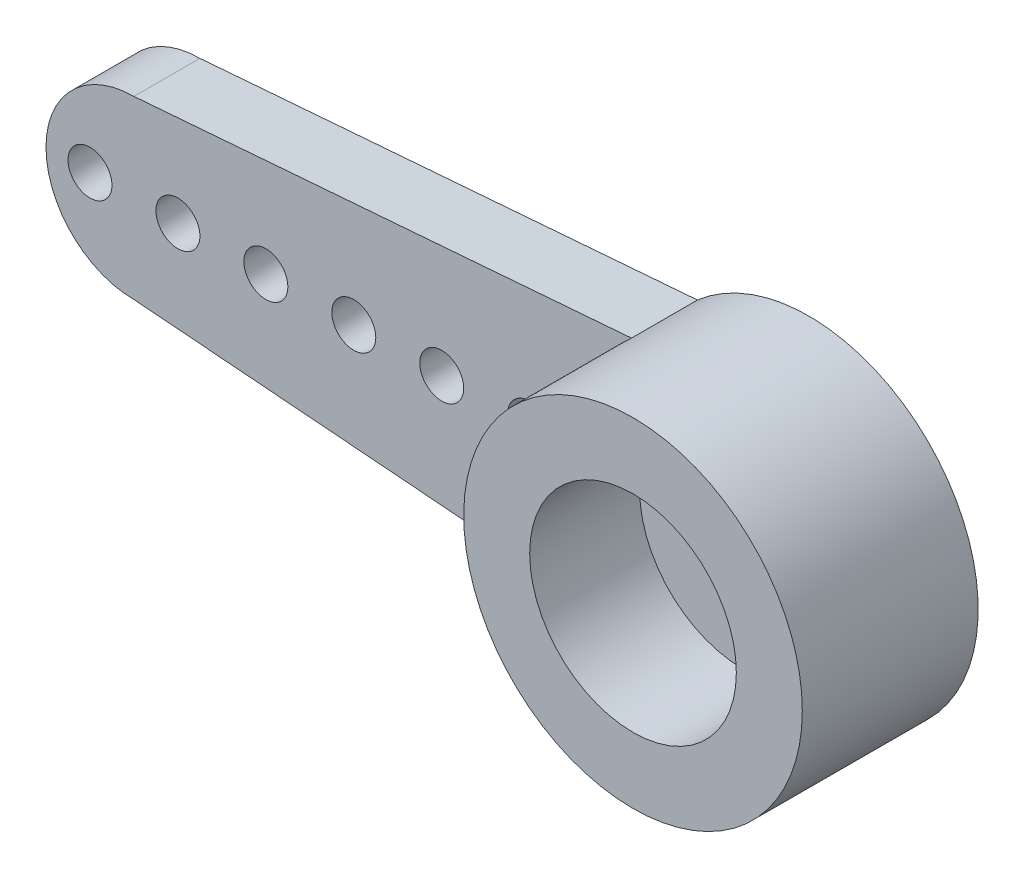
ISO-10303-21;
HEADER;
FILE_DESCRIPTION(('STEP AP214'),'2;1');
FILE_NAME('part.step','',(''),(''),'','','');
FILE_SCHEMA(('AUTOMOTIVE_DESIGN { 1 0 10303 214 1 1 1 1 }'));
ENDSEC;
DATA;
#1=APPLICATION_CONTEXT('core data for automotive mechanical design processes');
#2=APPLICATION_PROTOCOL_DEFINITION('international standard','automotive_design',2000,#1);
#3=PRODUCT_CONTEXT('',#1,'mechanical');
#4=PRODUCT('Part','Part','',(#3));
#5=PRODUCT_RELATED_PRODUCT_CATEGORY('part','',(#4));
#6=PRODUCT_DEFINITION_FORMATION('','',#4);
#7=PRODUCT_DEFINITION_CONTEXT('part definition',#1,'design');
#8=PRODUCT_DEFINITION('design','',#6,#7);
#9=PRODUCT_DEFINITION_SHAPE('','',#8);
#10=(LENGTH_UNIT() NAMED_UNIT(*) SI_UNIT(.MILLI.,.METRE.));
#11=(NAMED_UNIT(*) PLANE_ANGLE_UNIT() SI_UNIT($,.RADIAN.));
#12=(NAMED_UNIT(*) SI_UNIT($,.STERADIAN.) SOLID_ANGLE_UNIT());
#13=UNCERTAINTY_MEASURE_WITH_UNIT(LENGTH_MEASURE(1.E-05),#10,'distance_accuracy_value','');
#14=(GEOMETRIC_REPRESENTATION_CONTEXT(3) GLOBAL_UNCERTAINTY_ASSIGNED_CONTEXT((#13)) GLOBAL_UNIT_ASSIGNED_CONTEXT((#10,
#11,#12)) REPRESENTATION_CONTEXT('',''));
#15=CARTESIAN_POINT('',(0.,0.,0.));
#16=DIRECTION('',(0.,0.,1.));
#17=DIRECTION('',(1.,0.,0.));
#18=AXIS2_PLACEMENT_3D('',#15,#16,#17);
#19=CARTESIAN_POINT('',(0.,0.,4.));
#20=DIRECTION('',(0.,0.,-1.));
#21=DIRECTION('',(-1.,0.,0.));
#22=AXIS2_PLACEMENT_3D('',#19,#20,#21);
#23=CYLINDRICAL_SURFACE('',#22,2.35);
#24=CARTESIAN_POINT('',(0.,0.,4.));
#25=DIRECTION('',(0.,0.,1.));
#26=DIRECTION('',(1.,0.,0.));
#27=AXIS2_PLACEMENT_3D('',#24,#25,#26);
#28=CIRCLE('',#27,2.35);
#29=CARTESIAN_POINT('',(2.35,0.,4.));
#30=VERTEX_POINT('',#29);
#31=EDGE_CURVE('E110',#30,#30,#28,.T.);
#32=ORIENTED_EDGE('',*,*,#31,.T.);
#33=EDGE_LOOP('',(#32));
#34=FACE_BOUND('',#33,.T.);
#35=CARTESIAN_POINT('',(0.,0.,1.5));
#36=DIRECTION('',(0.,0.,-1.));
#37=DIRECTION('',(-1.,0.,0.));
#38=AXIS2_PLACEMENT_3D('',#35,#36,#37);
#39=CIRCLE('',#38,2.35);
#40=CARTESIAN_POINT('',(-2.35,0.,1.5));
#41=VERTEX_POINT('',#40);
#42=EDGE_CURVE('E107',#41,#41,#39,.T.);
#43=ORIENTED_EDGE('',*,*,#42,.T.);
#44=EDGE_LOOP('',(#43));
#45=FACE_BOUND('',#44,.T.);
#46=ADVANCED_FACE('F37',(#34,#45),#23,.F.);
#47=CARTESIAN_POINT('',(0.,0.,4.));
#48=DIRECTION('',(0.,0.,1.));
#49=DIRECTION('',(1.,0.,0.));
#50=AXIS2_PLACEMENT_3D('',#47,#48,#49);
#51=PLANE('',#50);
#52=CARTESIAN_POINT('',(0.,0.,4.));
#53=DIRECTION('',(0.,0.,1.));
#54=DIRECTION('',(1.,0.,0.));
#55=AXIS2_PLACEMENT_3D('',#52,#53,#54);
#56=CIRCLE('',#55,3.85);
#57=CARTESIAN_POINT('',(3.85,0.,4.));
#58=VERTEX_POINT('',#57);
#59=EDGE_CURVE('E114',#58,#58,#56,.T.);
#60=ORIENTED_EDGE('',*,*,#59,.T.);
#61=EDGE_LOOP('',(#60));
#62=FACE_BOUND('',#61,.T.);
#63=ORIENTED_EDGE('',*,*,#31,.F.);
#64=EDGE_LOOP('',(#63));
#65=FACE_BOUND('',#64,.T.);
#66=ADVANCED_FACE('F137',(#62,#65),#51,.T.);
#67=CARTESIAN_POINT('',(0.,0.,0.));
#68=DIRECTION('',(0.,0.,1.));
#69=DIRECTION('',(1.,0.,0.));
#70=AXIS2_PLACEMENT_3D('',#67,#68,#69);
#71=PLANE('',#70);
#72=CARTESIAN_POINT('',(-14.85,0.,0.));
#73=DIRECTION('',(0.,0.,1.));
#74=DIRECTION('',(1.,0.,0.));
#75=AXIS2_PLACEMENT_3D('',#72,#73,#74);
#76=CIRCLE('',#75,0.499999999999999);
#77=CARTESIAN_POINT('',(-14.35,0.,0.));
#78=VERTEX_POINT('',#77);
#79=EDGE_CURVE('E154',#78,#78,#76,.F.);
#80=ORIENTED_EDGE('',*,*,#79,.F.);
#81=EDGE_LOOP('',(#80));
#82=FACE_BOUND('',#81,.T.);
#83=CARTESIAN_POINT('',(-12.85,0.,0.));
#84=DIRECTION('',(0.,0.,1.));
#85=DIRECTION('',(1.,0.,0.));
#86=AXIS2_PLACEMENT_3D('',#83,#84,#85);
#87=CIRCLE('',#86,0.499999999999999);
#88=CARTESIAN_POINT('',(-12.35,0.,0.));
#89=VERTEX_POINT('',#88);
#90=EDGE_CURVE('E158',#89,#89,#87,.F.);
#91=ORIENTED_EDGE('',*,*,#90,.F.);
#92=EDGE_LOOP('',(#91));
#93=FACE_BOUND('',#92,.T.);
#94=CARTESIAN_POINT('',(-10.85,0.,0.));
#95=DIRECTION('',(0.,0.,1.));
#96=DIRECTION('',(1.,0.,0.));
#97=AXIS2_PLACEMENT_3D('',#94,#95,#96);
#98=CIRCLE('',#97,0.499999999999999);
#99=CARTESIAN_POINT('',(-10.35,0.,0.));
#100=VERTEX_POINT('',#99);
#101=EDGE_CURVE('E162',#100,#100,#98,.F.);
#102=ORIENTED_EDGE('',*,*,#101,.F.);
#103=EDGE_LOOP('',(#102));
#104=FACE_BOUND('',#103,.T.);
#105=CARTESIAN_POINT('',(-8.85,0.,0.));
#106=DIRECTION('',(0.,0.,1.));
#107=DIRECTION('',(1.,0.,0.));
#108=AXIS2_PLACEMENT_3D('',#105,#106,#107);
#109=CIRCLE('',#108,0.499999999999999);
#110=CARTESIAN_POINT('',(-8.35,0.,0.));
#111=VERTEX_POINT('',#110);
#112=EDGE_CURVE('E166',#111,#111,#109,.F.);
#113=ORIENTED_EDGE('',*,*,#112,.F.);
#114=EDGE_LOOP('',(#113));
#115=FACE_BOUND('',#114,.T.);
#116=CARTESIAN_POINT('',(-6.85,0.,0.));
#117=DIRECTION('',(0.,0.,1.));
#118=DIRECTION('',(1.,0.,0.));
#119=AXIS2_PLACEMENT_3D('',#116,#117,#118);
#120=CIRCLE('',#119,0.499999999999999);
#121=CARTESIAN_POINT('',(-6.35,0.,0.));
#122=VERTEX_POINT('',#121);
#123=EDGE_CURVE('E170',#122,#122,#120,.F.);
#124=ORIENTED_EDGE('',*,*,#123,.F.);
#125=EDGE_LOOP('',(#124));
#126=FACE_BOUND('',#125,.T.);
#127=CARTESIAN_POINT('',(-4.85,0.,0.));
#128=DIRECTION('',(0.,0.,1.));
#129=DIRECTION('',(1.,0.,0.));
#130=AXIS2_PLACEMENT_3D('',#127,#128,#129);
#131=CIRCLE('',#130,0.499999999999999);
#132=CARTESIAN_POINT('',(-4.35,0.,0.));
#133=VERTEX_POINT('',#132);
#134=EDGE_CURVE('E103',#133,#133,#131,.F.);
#135=ORIENTED_EDGE('',*,*,#134,.F.);
#136=EDGE_LOOP('',(#135));
#137=FACE_BOUND('',#136,.T.);
#138=DIRECTION('',(0.996860885732547,0.079173066736881,0.));
#139=VECTOR('',#138,1.);
#140=CARTESIAN_POINT('',(0.,3.1,0.));
#141=LINE('',#140,#139);
#142=CARTESIAN_POINT('',(-13.85,2.,0.));
#143=VERTEX_POINT('',#142);
#144=CARTESIAN_POINT('',(-2.53370243949322,2.89876731527491,0.));
#145=VERTEX_POINT('',#144);
#146=EDGE_CURVE('E84',#143,#145,#141,.T.);
#147=ORIENTED_EDGE('',*,*,#146,.T.);
#148=CARTESIAN_POINT('',(0.,0.,0.));
#149=DIRECTION('',(0.,0.,1.));
#150=DIRECTION('',(1.,0.,0.));
#151=AXIS2_PLACEMENT_3D('',#148,#149,#150);
#152=CIRCLE('',#151,3.85);
#153=CARTESIAN_POINT('',(-2.53370243949322,-2.89876731527491,0.));
#154=VERTEX_POINT('',#153);
#155=EDGE_CURVE('E113',#154,#145,#152,.T.);
#156=ORIENTED_EDGE('',*,*,#155,.F.);
#157=DIRECTION('',(-0.996860885732547,0.079173066736881,0.));
#158=VECTOR('',#157,1.);
#159=CARTESIAN_POINT('',(0.,-3.1,0.));
#160=LINE('',#159,#158);
#161=CARTESIAN_POINT('',(-13.85,-2.,0.));
#162=VERTEX_POINT('',#161);
#163=EDGE_CURVE('E101',#154,#162,#160,.T.);
#164=ORIENTED_EDGE('',*,*,#163,.T.);
#165=CARTESIAN_POINT('',(-13.85,0.,0.));
#166=DIRECTION('',(0.,0.,-1.));
#167=DIRECTION('',(-1.,0.,0.));
#168=AXIS2_PLACEMENT_3D('',#165,#166,#167);
#169=CIRCLE('',#168,2.);
#170=EDGE_CURVE('E91',#162,#143,#169,.T.);
#171=ORIENTED_EDGE('',*,*,#170,.T.);
#172=EDGE_LOOP('',(#147,#156,#164,#171));
#173=FACE_BOUND('',#172,.T.);
#174=ADVANCED_FACE('F121',(#82,#93,#104,#115,#126,#137,#173),#71,.F.);
#175=CARTESIAN_POINT('',(0.,0.,4.));
#176=DIRECTION('',(0.,0.,-1.));
#177=DIRECTION('',(-1.,0.,0.));
#178=AXIS2_PLACEMENT_3D('',#175,#176,#177);
#179=CYLINDRICAL_SURFACE('',#178,3.85);
#180=ORIENTED_EDGE('',*,*,#155,.T.);
#181=DIRECTION('',(0.,0.,-1.));
#182=VECTOR('',#181,1.);
#183=CARTESIAN_POINT('',(-2.53370243949322,2.89876731527491,4.));
#184=LINE('',#183,#182);
#185=CARTESIAN_POINT('',(-2.53370243949322,2.89876731527491,1.5));
#186=VERTEX_POINT('',#185);
#187=EDGE_CURVE('E11',#145,#186,#184,.F.);
#188=ORIENTED_EDGE('',*,*,#187,.T.);
#189=CARTESIAN_POINT('',(0.,0.,1.5));
#190=DIRECTION('',(0.,0.,-1.));
#191=DIRECTION('',(-1.,0.,0.));
#192=AXIS2_PLACEMENT_3D('',#189,#190,#191);
#193=CIRCLE('',#192,3.85);
#194=CARTESIAN_POINT('',(-2.53370243949322,-2.89876731527491,1.5));
#195=VERTEX_POINT('',#194);
#196=EDGE_CURVE('E54',#195,#186,#193,.T.);
#197=ORIENTED_EDGE('',*,*,#196,.F.);
#198=DIRECTION('',(0.,0.,-1.));
#199=VECTOR('',#198,1.);
#200=CARTESIAN_POINT('',(-2.53370243949322,-2.89876731527491,4.));
#201=LINE('',#200,#199);
#202=EDGE_CURVE('E45',#195,#154,#201,.T.);
#203=ORIENTED_EDGE('',*,*,#202,.T.);
#204=EDGE_LOOP('',(#180,#188,#197,#203));
#205=FACE_BOUND('',#204,.T.);
#206=ORIENTED_EDGE('',*,*,#59,.F.);
#207=EDGE_LOOP('',(#206));
#208=FACE_BOUND('',#207,.T.);
#209=ADVANCED_FACE('F39',(#205,#208),#179,.T.);
#210=CARTESIAN_POINT('',(0.,0.,1.5));
#211=DIRECTION('',(0.,0.,-1.));
#212=DIRECTION('',(-1.,0.,0.));
#213=AXIS2_PLACEMENT_3D('',#210,#211,#212);
#214=PLANE('',#213);
#215=ORIENTED_EDGE('',*,*,#42,.F.);
#216=EDGE_LOOP('',(#215));
#217=FACE_BOUND('',#216,.T.);
#218=ADVANCED_FACE('F126',(#217),#214,.F.);
#219=CARTESIAN_POINT('',(0.,3.1,1.5));
#220=DIRECTION('',(-0.079173066736881,0.996860885732547,0.));
#221=DIRECTION('',(-0.996860885732547,-0.079173066736881,0.));
#222=AXIS2_PLACEMENT_3D('',#219,#220,#221);
#223=PLANE('',#222);
#224=ORIENTED_EDGE('',*,*,#187,.F.);
#225=ORIENTED_EDGE('',*,*,#146,.F.);
#226=DIRECTION('',(0.,0.,-1.));
#227=VECTOR('',#226,1.);
#228=CARTESIAN_POINT('',(-13.85,2.,1.5));
#229=LINE('',#228,#227);
#230=CARTESIAN_POINT('',(-13.85,2.,1.5));
#231=VERTEX_POINT('',#230);
#232=EDGE_CURVE('E92',#231,#143,#229,.T.);
#233=ORIENTED_EDGE('',*,*,#232,.F.);
#234=DIRECTION('',(0.996860885732547,0.079173066736881,0.));
#235=VECTOR('',#234,1.);
#236=CARTESIAN_POINT('',(0.,3.1,1.5));
#237=LINE('',#236,#235);
#238=EDGE_CURVE('E93',#231,#186,#237,.T.);
#239=ORIENTED_EDGE('',*,*,#238,.T.);
#240=EDGE_LOOP('',(#224,#225,#233,#239));
#241=FACE_BOUND('',#240,.T.);
#242=ADVANCED_FACE('F124',(#241),#223,.T.);
#243=CARTESIAN_POINT('',(0.,-3.1,1.5));
#244=DIRECTION('',(-0.079173066736881,-0.996860885732547,0.));
#245=DIRECTION('',(0.996860885732547,-0.079173066736881,0.));
#246=AXIS2_PLACEMENT_3D('',#243,#244,#245);
#247=PLANE('',#246);
#248=ORIENTED_EDGE('',*,*,#202,.F.);
#249=DIRECTION('',(-0.996860885732547,0.079173066736881,0.));
#250=VECTOR('',#249,1.);
#251=CARTESIAN_POINT('',(0.,-3.1,1.5));
#252=LINE('',#251,#250);
#253=CARTESIAN_POINT('',(-13.85,-2.,1.5));
#254=VERTEX_POINT('',#253);
#255=EDGE_CURVE('E75',#195,#254,#252,.T.);
#256=ORIENTED_EDGE('',*,*,#255,.T.);
#257=DIRECTION('',(0.,0.,-1.));
#258=VECTOR('',#257,1.);
#259=CARTESIAN_POINT('',(-13.85,-2.,1.5));
#260=LINE('',#259,#258);
#261=EDGE_CURVE('E79',#254,#162,#260,.T.);
#262=ORIENTED_EDGE('',*,*,#261,.T.);
#263=ORIENTED_EDGE('',*,*,#163,.F.);
#264=EDGE_LOOP('',(#248,#256,#262,#263));
#265=FACE_BOUND('',#264,.T.);
#266=ADVANCED_FACE('F77',(#265),#247,.T.);
#267=CARTESIAN_POINT('',(-13.85,0.,1.5));
#268=DIRECTION('',(0.,0.,-1.));
#269=DIRECTION('',(-1.,0.,0.));
#270=AXIS2_PLACEMENT_3D('',#267,#268,#269);
#271=CYLINDRICAL_SURFACE('',#270,2.);
#272=ORIENTED_EDGE('',*,*,#170,.F.);
#273=ORIENTED_EDGE('',*,*,#261,.F.);
#274=CARTESIAN_POINT('',(-13.85,0.,1.5));
#275=DIRECTION('',(0.,0.,-1.));
#276=DIRECTION('',(-1.,0.,0.));
#277=AXIS2_PLACEMENT_3D('',#274,#275,#276);
#278=CIRCLE('',#277,2.);
#279=EDGE_CURVE('E83',#254,#231,#278,.T.);
#280=ORIENTED_EDGE('',*,*,#279,.T.);
#281=ORIENTED_EDGE('',*,*,#232,.T.);
#282=EDGE_LOOP('',(#272,#273,#280,#281));
#283=FACE_BOUND('',#282,.T.);
#284=ADVANCED_FACE('F88',(#283),#271,.T.);
#285=CARTESIAN_POINT('',(-14.85,0.,1.5));
#286=DIRECTION('',(0.,0.,1.));
#287=DIRECTION('',(1.,0.,0.));
#288=AXIS2_PLACEMENT_3D('',#285,#286,#287);
#289=CIRCLE('',#288,0.499999999999999);
#290=CARTESIAN_POINT('',(-14.35,0.,1.5));
#291=VERTEX_POINT('',#290);
#292=EDGE_CURVE('E195',#291,#291,#289,.T.);
#293=ORIENTED_EDGE('',*,*,#292,.F.);
#294=EDGE_LOOP('',(#293));
#295=FACE_BOUND('',#294,.T.);
#296=CARTESIAN_POINT('',(-12.85,0.,1.5));
#297=DIRECTION('',(0.,0.,1.));
#298=DIRECTION('',(1.,0.,0.));
#299=AXIS2_PLACEMENT_3D('',#296,#297,#298);
#300=CIRCLE('',#299,0.499999999999999);
#301=CARTESIAN_POINT('',(-12.35,0.,1.5));
#302=VERTEX_POINT('',#301);
#303=EDGE_CURVE('E191',#302,#302,#300,.T.);
#304=ORIENTED_EDGE('',*,*,#303,.F.);
#305=EDGE_LOOP('',(#304));
#306=FACE_BOUND('',#305,.T.);
#307=CARTESIAN_POINT('',(-10.85,0.,1.5));
#308=DIRECTION('',(0.,0.,1.));
#309=DIRECTION('',(1.,0.,0.));
#310=AXIS2_PLACEMENT_3D('',#307,#308,#309);
#311=CIRCLE('',#310,0.499999999999999);
#312=CARTESIAN_POINT('',(-10.35,0.,1.5));
#313=VERTEX_POINT('',#312);
#314=EDGE_CURVE('E187',#313,#313,#311,.T.);
#315=ORIENTED_EDGE('',*,*,#314,.F.);
#316=EDGE_LOOP('',(#315));
#317=FACE_BOUND('',#316,.T.);
#318=CARTESIAN_POINT('',(-8.85,0.,1.5));
#319=DIRECTION('',(0.,0.,1.));
#320=DIRECTION('',(1.,0.,0.));
#321=AXIS2_PLACEMENT_3D('',#318,#319,#320);
#322=CIRCLE('',#321,0.499999999999999);
#323=CARTESIAN_POINT('',(-8.35,0.,1.5));
#324=VERTEX_POINT('',#323);
#325=EDGE_CURVE('E183',#324,#324,#322,.T.);
#326=ORIENTED_EDGE('',*,*,#325,.F.);
#327=EDGE_LOOP('',(#326));
#328=FACE_BOUND('',#327,.T.);
#329=CARTESIAN_POINT('',(-6.85,0.,1.5));
#330=DIRECTION('',(0.,0.,1.));
#331=DIRECTION('',(1.,0.,0.));
#332=AXIS2_PLACEMENT_3D('',#329,#330,#331);
#333=CIRCLE('',#332,0.499999999999999);
#334=CARTESIAN_POINT('',(-6.35,0.,1.5));
#335=VERTEX_POINT('',#334);
#336=EDGE_CURVE('E179',#335,#335,#333,.T.);
#337=ORIENTED_EDGE('',*,*,#336,.F.);
#338=EDGE_LOOP('',(#337));
#339=FACE_BOUND('',#338,.T.);
#340=CARTESIAN_POINT('',(-4.85,0.,1.5));
#341=DIRECTION('',(0.,0.,1.));
#342=DIRECTION('',(1.,0.,0.));
#343=AXIS2_PLACEMENT_3D('',#340,#341,#342);
#344=CIRCLE('',#343,0.499999999999999);
#345=CARTESIAN_POINT('',(-4.35,0.,1.5));
#346=VERTEX_POINT('',#345);
#347=EDGE_CURVE('E174',#346,#346,#344,.T.);
#348=ORIENTED_EDGE('',*,*,#347,.F.);
#349=EDGE_LOOP('',(#348));
#350=FACE_BOUND('',#349,.T.);
#351=ORIENTED_EDGE('',*,*,#255,.F.);
#352=ORIENTED_EDGE('',*,*,#196,.T.);
#353=ORIENTED_EDGE('',*,*,#238,.F.);
#354=ORIENTED_EDGE('',*,*,#279,.F.);
#355=EDGE_LOOP('',(#351,#352,#353,#354));
#356=FACE_BOUND('',#355,.T.);
#357=ADVANCED_FACE('F95',(#295,#306,#317,#328,#339,#350,#356),#214,.F.);
#358=CARTESIAN_POINT('',(-4.85,0.,-0.000999999999999916));
#359=DIRECTION('',(0.,0.,1.));
#360=DIRECTION('',(1.,0.,0.));
#361=AXIS2_PLACEMENT_3D('',#358,#359,#360);
#362=CYLINDRICAL_SURFACE('',#361,0.499999999999999);
#363=ORIENTED_EDGE('',*,*,#347,.T.);
#364=EDGE_LOOP('',(#363));
#365=FACE_BOUND('',#364,.T.);
#366=ORIENTED_EDGE('',*,*,#134,.T.);
#367=EDGE_LOOP('',(#366));
#368=FACE_BOUND('',#367,.T.);
#369=ADVANCED_FACE('F204',(#365,#368),#362,.F.);
#370=CARTESIAN_POINT('',(-6.85,0.,-0.000999999999999916));
#371=DIRECTION('',(0.,0.,1.));
#372=DIRECTION('',(1.,0.,0.));
#373=AXIS2_PLACEMENT_3D('',#370,#371,#372);
#374=CYLINDRICAL_SURFACE('',#373,0.499999999999999);
#375=ORIENTED_EDGE('',*,*,#336,.T.);
#376=EDGE_LOOP('',(#375));
#377=FACE_BOUND('',#376,.T.);
#378=ORIENTED_EDGE('',*,*,#123,.T.);
#379=EDGE_LOOP('',(#378));
#380=FACE_BOUND('',#379,.T.);
#381=ADVANCED_FACE('F216',(#377,#380),#374,.F.);
#382=CARTESIAN_POINT('',(-8.85,0.,-0.000999999999999916));
#383=DIRECTION('',(0.,0.,1.));
#384=DIRECTION('',(1.,0.,0.));
#385=AXIS2_PLACEMENT_3D('',#382,#383,#384);
#386=CYLINDRICAL_SURFACE('',#385,0.499999999999999);
#387=ORIENTED_EDGE('',*,*,#325,.T.);
#388=EDGE_LOOP('',(#387));
#389=FACE_BOUND('',#388,.T.);
#390=ORIENTED_EDGE('',*,*,#112,.T.);
#391=EDGE_LOOP('',(#390));
#392=FACE_BOUND('',#391,.T.);
#393=ADVANCED_FACE('F221',(#389,#392),#386,.F.);
#394=CARTESIAN_POINT('',(-10.85,0.,-0.000999999999999916));
#395=DIRECTION('',(0.,0.,1.));
#396=DIRECTION('',(1.,0.,0.));
#397=AXIS2_PLACEMENT_3D('',#394,#395,#396);
#398=CYLINDRICAL_SURFACE('',#397,0.499999999999999);
#399=ORIENTED_EDGE('',*,*,#314,.T.);
#400=EDGE_LOOP('',(#399));
#401=FACE_BOUND('',#400,.T.);
#402=ORIENTED_EDGE('',*,*,#101,.T.);
#403=EDGE_LOOP('',(#402));
#404=FACE_BOUND('',#403,.T.);
#405=ADVANCED_FACE('F227',(#401,#404),#398,.F.);
#406=CARTESIAN_POINT('',(-12.85,0.,-0.000999999999999916));
#407=DIRECTION('',(0.,0.,1.));
#408=DIRECTION('',(1.,0.,0.));
#409=AXIS2_PLACEMENT_3D('',#406,#407,#408);
#410=CYLINDRICAL_SURFACE('',#409,0.499999999999999);
#411=ORIENTED_EDGE('',*,*,#303,.T.);
#412=EDGE_LOOP('',(#411));
#413=FACE_BOUND('',#412,.T.);
#414=ORIENTED_EDGE('',*,*,#90,.T.);
#415=EDGE_LOOP('',(#414));
#416=FACE_BOUND('',#415,.T.);
#417=ADVANCED_FACE('F231',(#413,#416),#410,.F.);
#418=CARTESIAN_POINT('',(-14.85,0.,-0.000999999999999916));
#419=DIRECTION('',(0.,0.,1.));
#420=DIRECTION('',(1.,0.,0.));
#421=AXIS2_PLACEMENT_3D('',#418,#419,#420);
#422=CYLINDRICAL_SURFACE('',#421,0.499999999999999);
#423=ORIENTED_EDGE('',*,*,#292,.T.);
#424=EDGE_LOOP('',(#423));
#425=FACE_BOUND('',#424,.T.);
#426=ORIENTED_EDGE('',*,*,#79,.T.);
#427=EDGE_LOOP('',(#426));
#428=FACE_BOUND('',#427,.T.);
#429=ADVANCED_FACE('F199',(#425,#428),#422,.F.);
#430=CLOSED_SHELL('',(#46,#66,#174,#209,#218,#242,#266,#284,#357,#369,#381,#393,#405,#417,#429));
#431=MANIFOLD_SOLID_BREP('B2',#430);
#432=ADVANCED_BREP_SHAPE_REPRESENTATION('',(#18,#431),#14);
#433=SHAPE_DEFINITION_REPRESENTATION(#9,#432);
ENDSEC;
END-ISO-10303-21;
